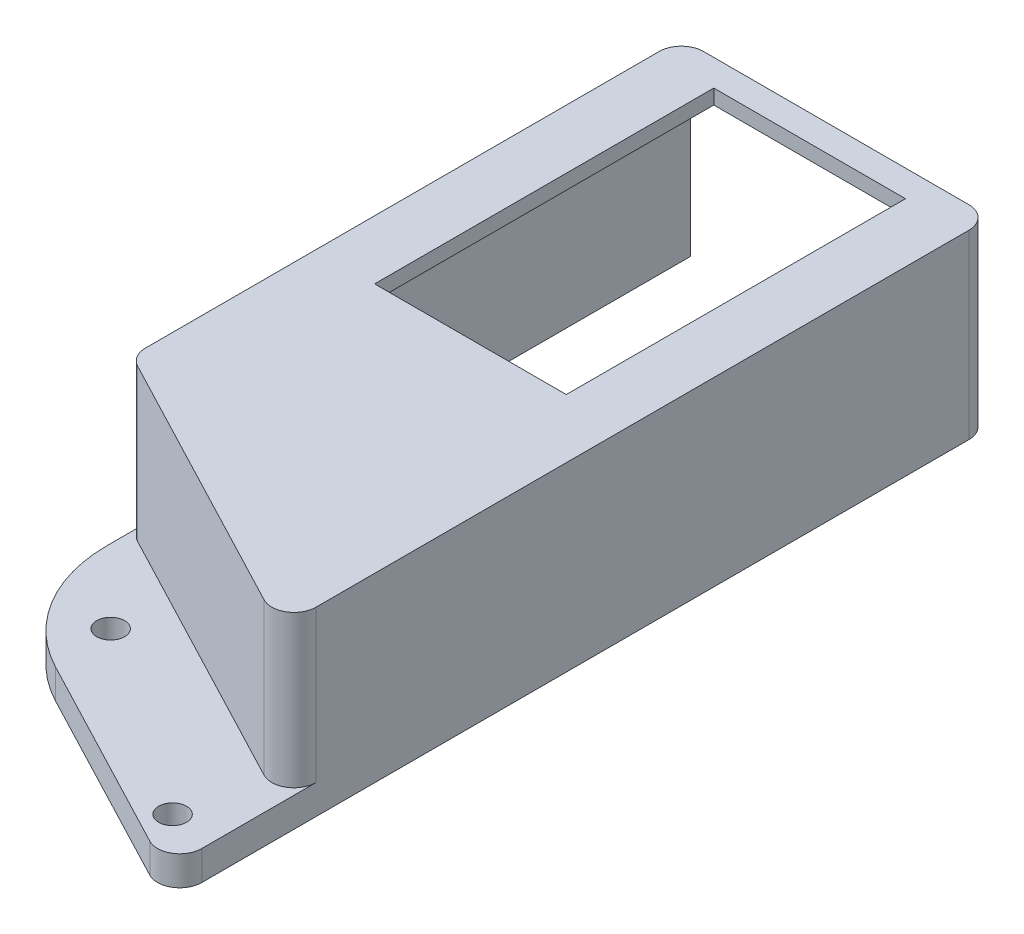
ISO-10303-21;
HEADER;
FILE_DESCRIPTION(('STEP AP214'),'2;1');
FILE_NAME('part.step','',(''),(''),'','','');
FILE_SCHEMA(('AUTOMOTIVE_DESIGN { 1 0 10303 214 1 1 1 1 }'));
ENDSEC;
DATA;
#1=APPLICATION_CONTEXT('core data for automotive mechanical design processes');
#2=APPLICATION_PROTOCOL_DEFINITION('international standard','automotive_design',2000,#1);
#3=PRODUCT_CONTEXT('',#1,'mechanical');
#4=PRODUCT('Part','Part','',(#3));
#5=PRODUCT_RELATED_PRODUCT_CATEGORY('part','',(#4));
#6=PRODUCT_DEFINITION_FORMATION('','',#4);
#7=PRODUCT_DEFINITION_CONTEXT('part definition',#1,'design');
#8=PRODUCT_DEFINITION('design','',#6,#7);
#9=PRODUCT_DEFINITION_SHAPE('','',#8);
#10=(LENGTH_UNIT() NAMED_UNIT(*) SI_UNIT(.MILLI.,.METRE.));
#11=(NAMED_UNIT(*) PLANE_ANGLE_UNIT() SI_UNIT($,.RADIAN.));
#12=(NAMED_UNIT(*) SI_UNIT($,.STERADIAN.) SOLID_ANGLE_UNIT());
#13=UNCERTAINTY_MEASURE_WITH_UNIT(LENGTH_MEASURE(1.E-05),#10,'distance_accuracy_value','');
#14=(GEOMETRIC_REPRESENTATION_CONTEXT(3) GLOBAL_UNCERTAINTY_ASSIGNED_CONTEXT((#13)) GLOBAL_UNIT_ASSIGNED_CONTEXT((#10,
#11,#12)) REPRESENTATION_CONTEXT('',''));
#15=CARTESIAN_POINT('',(0.,0.,0.));
#16=DIRECTION('',(0.,0.,1.));
#17=DIRECTION('',(1.,0.,0.));
#18=AXIS2_PLACEMENT_3D('',#15,#16,#17);
#19=CARTESIAN_POINT('',(-10.5,-12.3,0.));
#20=DIRECTION('',(1.,0.,0.));
#21=DIRECTION('',(0.,0.,-1.));
#22=AXIS2_PLACEMENT_3D('',#19,#20,#21);
#23=PLANE('',#22);
#24=DIRECTION('',(0.,0.,-1.));
#25=VECTOR('',#24,1.);
#26=CARTESIAN_POINT('',(-10.5,0.,0.));
#27=LINE('',#26,#25);
#28=CARTESIAN_POINT('',(-10.5,0.,36.3430124226153));
#29=VERTEX_POINT('',#28);
#30=CARTESIAN_POINT('',(-10.5,0.,1.5));
#31=VERTEX_POINT('',#30);
#32=EDGE_CURVE('E219',#29,#31,#27,.T.);
#33=ORIENTED_EDGE('',*,*,#32,.T.);
#34=DIRECTION('',(0.,1.,0.));
#35=VECTOR('',#34,1.);
#36=CARTESIAN_POINT('',(-10.5,-12.3,1.5));
#37=LINE('',#36,#35);
#38=CARTESIAN_POINT('',(-10.5,-12.3,1.5));
#39=VERTEX_POINT('',#38);
#40=EDGE_CURVE('E321',#31,#39,#37,.F.);
#41=ORIENTED_EDGE('',*,*,#40,.T.);
#42=DIRECTION('',(0.,0.,-1.));
#43=VECTOR('',#42,1.);
#44=CARTESIAN_POINT('',(-10.5,-12.3,0.));
#45=LINE('',#44,#43);
#46=CARTESIAN_POINT('',(-10.5,-12.3,38.9492670560669));
#47=VERTEX_POINT('',#46);
#48=EDGE_CURVE('E218',#47,#39,#45,.T.);
#49=ORIENTED_EDGE('',*,*,#48,.F.);
#50=DIRECTION('',(0.,1.,0.));
#51=VECTOR('',#50,1.);
#52=CARTESIAN_POINT('',(-10.5,-12.3,38.9492670560669));
#53=LINE('',#52,#51);
#54=CARTESIAN_POINT('',(-10.5,-10.3,38.9492670560669));
#55=VERTEX_POINT('',#54);
#56=EDGE_CURVE('E237',#47,#55,#53,.T.);
#57=ORIENTED_EDGE('',*,*,#56,.T.);
#58=DIRECTION('',(0.,0.,-1.));
#59=VECTOR('',#58,1.);
#60=CARTESIAN_POINT('',(-10.5,-10.3,0.));
#61=LINE('',#60,#59);
#62=CARTESIAN_POINT('',(-10.5,-10.3,36.3430124226153));
#63=VERTEX_POINT('',#62);
#64=EDGE_CURVE('E81',#55,#63,#61,.T.);
#65=ORIENTED_EDGE('',*,*,#64,.T.);
#66=DIRECTION('',(0.,1.,0.));
#67=VECTOR('',#66,1.);
#68=CARTESIAN_POINT('',(-10.5,0.,36.3430124226153));
#69=LINE('',#68,#67);
#70=EDGE_CURVE('E318',#63,#29,#69,.T.);
#71=ORIENTED_EDGE('',*,*,#70,.T.);
#72=EDGE_LOOP('',(#33,#41,#49,#57,#65,#71));
#73=FACE_BOUND('',#72,.T.);
#74=ADVANCED_FACE('F65',(#73),#23,.F.);
#75=CARTESIAN_POINT('',(0.,0.,0.));
#76=DIRECTION('',(0.,1.,0.));
#77=DIRECTION('',(0.,0.,1.));
#78=AXIS2_PLACEMENT_3D('',#75,#76,#77);
#79=PLANE('',#78);
#80=DIRECTION('',(1.,0.,0.));
#81=VECTOR('',#80,1.);
#82=CARTESIAN_POINT('',(0.,0.,1.80066534325666));
#83=LINE('',#82,#81);
#84=CARTESIAN_POINT('',(-6.5,0.,1.80066534325666));
#85=VERTEX_POINT('',#84);
#86=CARTESIAN_POINT('',(6.5,0.,1.80066534325666));
#87=VERTEX_POINT('',#86);
#88=EDGE_CURVE('E382',#85,#87,#83,.T.);
#89=ORIENTED_EDGE('',*,*,#88,.T.);
#90=DIRECTION('',(0.,0.,1.));
#91=VECTOR('',#90,1.);
#92=CARTESIAN_POINT('',(6.5,0.,0.));
#93=LINE('',#92,#91);
#94=CARTESIAN_POINT('',(6.5,0.,24.8006653432567));
#95=VERTEX_POINT('',#94);
#96=EDGE_CURVE('E378',#87,#95,#93,.T.);
#97=ORIENTED_EDGE('',*,*,#96,.T.);
#98=DIRECTION('',(1.,0.,0.));
#99=VECTOR('',#98,1.);
#100=CARTESIAN_POINT('',(0.,0.,24.8006653432567));
#101=LINE('',#100,#99);
#102=CARTESIAN_POINT('',(-6.5,0.,24.8006653432567));
#103=VERTEX_POINT('',#102);
#104=EDGE_CURVE('E374',#103,#95,#101,.T.);
#105=ORIENTED_EDGE('',*,*,#104,.F.);
#106=DIRECTION('',(0.,0.,1.));
#107=VECTOR('',#106,1.);
#108=CARTESIAN_POINT('',(-6.5,0.,0.));
#109=LINE('',#108,#107);
#110=EDGE_CURVE('E337',#85,#103,#109,.T.);
#111=ORIENTED_EDGE('',*,*,#110,.F.);
#112=EDGE_LOOP('',(#89,#97,#105,#111));
#113=FACE_BOUND('',#112,.T.);
#114=DIRECTION('',(0.,0.,1.));
#115=VECTOR('',#114,1.);
#116=CARTESIAN_POINT('',(10.5,0.,0.));
#117=LINE('',#116,#115);
#118=CARTESIAN_POINT('',(10.5,0.,1.5));
#119=VERTEX_POINT('',#118);
#120=CARTESIAN_POINT('',(10.5,0.,45.7715838511867));
#121=VERTEX_POINT('',#120);
#122=EDGE_CURVE('E386',#119,#121,#117,.T.);
#123=ORIENTED_EDGE('',*,*,#122,.F.);
#124=CARTESIAN_POINT('',(9.,0.,1.5));
#125=DIRECTION('',(0.,1.,0.));
#126=DIRECTION('',(0.,0.,1.));
#127=AXIS2_PLACEMENT_3D('',#124,#125,#126);
#128=CIRCLE('',#127,1.5);
#129=CARTESIAN_POINT('',(9.,0.,0.));
#130=VERTEX_POINT('',#129);
#131=EDGE_CURVE('E277',#119,#130,#128,.T.);
#132=ORIENTED_EDGE('',*,*,#131,.T.);
#133=DIRECTION('',(1.,0.,0.));
#134=VECTOR('',#133,1.);
#135=CARTESIAN_POINT('',(0.,0.,0.));
#136=LINE('',#135,#134);
#137=CARTESIAN_POINT('',(-9.,0.,0.));
#138=VERTEX_POINT('',#137);
#139=EDGE_CURVE('E346',#138,#130,#136,.T.);
#140=ORIENTED_EDGE('',*,*,#139,.F.);
#141=CARTESIAN_POINT('',(-9.,0.,1.5));
#142=DIRECTION('',(0.,1.,0.));
#143=DIRECTION('',(0.,0.,1.));
#144=AXIS2_PLACEMENT_3D('',#141,#142,#143);
#145=CIRCLE('',#144,1.5);
#146=EDGE_CURVE('E271',#138,#31,#145,.T.);
#147=ORIENTED_EDGE('',*,*,#146,.T.);
#148=ORIENTED_EDGE('',*,*,#32,.F.);
#149=CARTESIAN_POINT('',(-9.,0.,36.3430124226153));
#150=DIRECTION('',(0.,1.,0.));
#151=DIRECTION('',(0.,0.,1.));
#152=AXIS2_PLACEMENT_3D('',#149,#150,#151);
#153=CIRCLE('',#152,1.5);
#154=CARTESIAN_POINT('',(-9.69601049200583,0.,37.6717597255356));
#155=VERTEX_POINT('',#154);
#156=EDGE_CURVE('E268',#29,#155,#153,.T.);
#157=ORIENTED_EDGE('',*,*,#156,.T.);
#158=DIRECTION('',(0.885831535280156,0.,0.464006994670557));
#159=VECTOR('',#158,1.);
#160=CARTESIAN_POINT('',(-17.5718750287036,0.,33.5463068729796));
#161=LINE('',#160,#159);
#162=CARTESIAN_POINT('',(8.30398950799418,0.,47.100331154107));
#163=VERTEX_POINT('',#162);
#164=EDGE_CURVE('E429',#155,#163,#161,.T.);
#165=ORIENTED_EDGE('',*,*,#164,.T.);
#166=CARTESIAN_POINT('',(9.00000000000001,0.,45.7715838511867));
#167=DIRECTION('',(0.,1.,0.));
#168=DIRECTION('',(0.,0.,1.));
#169=AXIS2_PLACEMENT_3D('',#166,#167,#168);
#170=CIRCLE('',#169,1.5);
#171=EDGE_CURVE('E274',#163,#121,#170,.T.);
#172=ORIENTED_EDGE('',*,*,#171,.T.);
#173=EDGE_LOOP('',(#123,#132,#140,#147,#148,#157,#165,#172));
#174=FACE_BOUND('',#173,.T.);
#175=ADVANCED_FACE('F351',(#113,#174),#79,.T.);
#176=CARTESIAN_POINT('',(10.5,-1.,0.));
#177=DIRECTION('',(-1.,0.,0.));
#178=DIRECTION('',(0.,0.,1.));
#179=AXIS2_PLACEMENT_3D('',#176,#177,#178);
#180=PLANE('',#179);
#181=DIRECTION('',(0.,0.,1.));
#182=VECTOR('',#181,1.);
#183=CARTESIAN_POINT('',(10.5,-12.3,0.));
#184=LINE('',#183,#182);
#185=CARTESIAN_POINT('',(10.5,-12.3,1.5));
#186=VERTEX_POINT('',#185);
#187=CARTESIAN_POINT('',(10.5,-12.3,53.5209614869815));
#188=VERTEX_POINT('',#187);
#189=EDGE_CURVE('E413',#186,#188,#184,.T.);
#190=ORIENTED_EDGE('',*,*,#189,.F.);
#191=DIRECTION('',(0.,1.,0.));
#192=VECTOR('',#191,1.);
#193=CARTESIAN_POINT('',(10.5,-1.,1.5));
#194=LINE('',#193,#192);
#195=EDGE_CURVE('E264',#186,#119,#194,.T.);
#196=ORIENTED_EDGE('',*,*,#195,.T.);
#197=ORIENTED_EDGE('',*,*,#122,.T.);
#198=DIRECTION('',(0.,1.,0.));
#199=VECTOR('',#198,1.);
#200=CARTESIAN_POINT('',(10.5,-10.3,45.7715838511867));
#201=LINE('',#200,#199);
#202=CARTESIAN_POINT('',(10.5,-10.3,45.7715838511867));
#203=VERTEX_POINT('',#202);
#204=EDGE_CURVE('E257',#121,#203,#201,.F.);
#205=ORIENTED_EDGE('',*,*,#204,.T.);
#206=DIRECTION('',(0.,0.,1.));
#207=VECTOR('',#206,1.);
#208=CARTESIAN_POINT('',(10.5,-10.3,0.));
#209=LINE('',#208,#207);
#210=CARTESIAN_POINT('',(10.5,-10.3,53.5209614869815));
#211=VERTEX_POINT('',#210);
#212=EDGE_CURVE('E231',#203,#211,#209,.T.);
#213=ORIENTED_EDGE('',*,*,#212,.T.);
#214=DIRECTION('',(0.,1.,0.));
#215=VECTOR('',#214,1.);
#216=CARTESIAN_POINT('',(10.5,-1.,53.5209614869815));
#217=LINE('',#216,#215);
#218=EDGE_CURVE('E261',#211,#188,#217,.F.);
#219=ORIENTED_EDGE('',*,*,#218,.T.);
#220=EDGE_LOOP('',(#190,#196,#197,#205,#213,#219));
#221=FACE_BOUND('',#220,.T.);
#222=ADVANCED_FACE('F475',(#221),#180,.F.);
#223=CARTESIAN_POINT('',(-20.7571174377224,-12.3,39.6272241992883));
#224=DIRECTION('',(0.464006994670557,0.,-0.885831535280155));
#225=DIRECTION('',(-0.885831535280155,0.,-0.464006994670557));
#226=AXIS2_PLACEMENT_3D('',#223,#224,#225);
#227=PLANE('',#226);
#228=DIRECTION('',(-0.885831535280155,0.,-0.464006994670557));
#229=VECTOR('',#228,1.);
#230=CARTESIAN_POINT('',(-20.7571174377224,-12.3,39.6272241992883));
#231=LINE('',#230,#229);
#232=CARTESIAN_POINT('',(8.30398950799417,-12.3,54.8497087899017));
#233=VERTEX_POINT('',#232);
#234=CARTESIAN_POINT('',(-5.14006994670557,-12.3,47.8075824088685));
#235=VERTEX_POINT('',#234);
#236=EDGE_CURVE('E418',#233,#235,#231,.T.);
#237=ORIENTED_EDGE('',*,*,#236,.F.);
#238=DIRECTION('',(0.,1.,0.));
#239=VECTOR('',#238,1.);
#240=CARTESIAN_POINT('',(8.30398950799417,-12.3,54.8497087899017));
#241=LINE('',#240,#239);
#242=CARTESIAN_POINT('',(8.30398950799417,-10.3,54.8497087899017));
#243=VERTEX_POINT('',#242);
#244=EDGE_CURVE('E304',#233,#243,#241,.T.);
#245=ORIENTED_EDGE('',*,*,#244,.T.);
#246=DIRECTION('',(-0.885831535280155,0.,-0.464006994670557));
#247=VECTOR('',#246,1.);
#248=CARTESIAN_POINT('',(-20.7571174377224,-10.3,39.6272241992883));
#249=LINE('',#248,#247);
#250=CARTESIAN_POINT('',(-5.14006994670557,-10.3,47.8075824088685));
#251=VERTEX_POINT('',#250);
#252=EDGE_CURVE('E437',#243,#251,#249,.T.);
#253=ORIENTED_EDGE('',*,*,#252,.T.);
#254=DIRECTION('',(0.,1.,0.));
#255=VECTOR('',#254,1.);
#256=CARTESIAN_POINT('',(-5.14006994670557,-12.3,47.8075824088685));
#257=LINE('',#256,#255);
#258=EDGE_CURVE('E250',#251,#235,#257,.F.);
#259=ORIENTED_EDGE('',*,*,#258,.T.);
#260=EDGE_LOOP('',(#237,#245,#253,#259));
#261=FACE_BOUND('',#260,.T.);
#262=ADVANCED_FACE('F466',(#261),#227,.F.);
#263=CARTESIAN_POINT('',(7.50000000000001,-12.3,52.5));
#264=DIRECTION('',(0.,1.,0.));
#265=DIRECTION('',(0.,0.,1.));
#266=AXIS2_PLACEMENT_3D('',#263,#264,#265);
#267=CYLINDRICAL_SURFACE('',#266,0.94630539720182);
#268=CARTESIAN_POINT('',(7.50000000000001,-12.3,52.5));
#269=DIRECTION('',(0.,1.,0.));
#270=DIRECTION('',(0.,0.,1.));
#271=AXIS2_PLACEMENT_3D('',#268,#269,#270);
#272=CIRCLE('',#271,0.94630539720182);
#273=CARTESIAN_POINT('',(7.50000000000001,-12.3,53.4463053972018));
#274=VERTEX_POINT('',#273);
#275=EDGE_CURVE('E422',#274,#274,#272,.T.);
#276=ORIENTED_EDGE('',*,*,#275,.F.);
#277=EDGE_LOOP('',(#276));
#278=FACE_BOUND('',#277,.T.);
#279=CARTESIAN_POINT('',(7.50000000000001,-10.3,52.5));
#280=DIRECTION('',(0.,1.,0.));
#281=DIRECTION('',(0.,0.,1.));
#282=AXIS2_PLACEMENT_3D('',#279,#280,#281);
#283=CIRCLE('',#282,0.94630539720182);
#284=CARTESIAN_POINT('',(7.50000000000001,-10.3,53.4463053972018));
#285=VERTEX_POINT('',#284);
#286=EDGE_CURVE('E445',#285,#285,#283,.T.);
#287=ORIENTED_EDGE('',*,*,#286,.T.);
#288=EDGE_LOOP('',(#287));
#289=FACE_BOUND('',#288,.T.);
#290=ADVANCED_FACE('F516',(#278,#289),#267,.F.);
#291=CARTESIAN_POINT('',(-5.49999999999999,-12.3,43.7));
#292=DIRECTION('',(0.,1.,0.));
#293=DIRECTION('',(0.,0.,1.));
#294=AXIS2_PLACEMENT_3D('',#291,#292,#293);
#295=CYLINDRICAL_SURFACE('',#294,0.946305397201834);
#296=CARTESIAN_POINT('',(-5.49999999999999,-12.3,43.7));
#297=DIRECTION('',(0.,1.,0.));
#298=DIRECTION('',(0.,0.,1.));
#299=AXIS2_PLACEMENT_3D('',#296,#297,#298);
#300=CIRCLE('',#299,0.946305397201834);
#301=CARTESIAN_POINT('',(-5.49999999999999,-12.3,44.6463053972018));
#302=VERTEX_POINT('',#301);
#303=EDGE_CURVE('E230',#302,#302,#300,.T.);
#304=ORIENTED_EDGE('',*,*,#303,.F.);
#305=EDGE_LOOP('',(#304));
#306=FACE_BOUND('',#305,.T.);
#307=CARTESIAN_POINT('',(-5.49999999999999,-10.3,43.7));
#308=DIRECTION('',(0.,1.,0.));
#309=DIRECTION('',(0.,0.,1.));
#310=AXIS2_PLACEMENT_3D('',#307,#308,#309);
#311=CIRCLE('',#310,0.946305397201834);
#312=CARTESIAN_POINT('',(-5.49999999999999,-10.3,44.6463053972018));
#313=VERTEX_POINT('',#312);
#314=EDGE_CURVE('E433',#313,#313,#311,.T.);
#315=ORIENTED_EDGE('',*,*,#314,.T.);
#316=EDGE_LOOP('',(#315));
#317=FACE_BOUND('',#316,.T.);
#318=ADVANCED_FACE('F453',(#306,#317),#295,.F.);
#319=CARTESIAN_POINT('',(-9.7,-12.3,0.));
#320=DIRECTION('',(-1.,0.,0.));
#321=DIRECTION('',(0.,0.,1.));
#322=AXIS2_PLACEMENT_3D('',#319,#320,#321);
#323=PLANE('',#322);
#324=DIRECTION('',(0.,0.,1.));
#325=VECTOR('',#324,1.);
#326=CARTESIAN_POINT('',(-9.7,-12.3,0.));
#327=LINE('',#326,#325);
#328=CARTESIAN_POINT('',(-9.7,-12.3,0.173350083857839));
#329=VERTEX_POINT('',#328);
#330=CARTESIAN_POINT('',(-9.7,-12.3,35.993109849659));
#331=VERTEX_POINT('',#330);
#332=EDGE_CURVE('E204',#329,#331,#327,.T.);
#333=ORIENTED_EDGE('',*,*,#332,.F.);
#334=DIRECTION('',(0.,1.,0.));
#335=VECTOR('',#334,1.);
#336=CARTESIAN_POINT('',(-9.7,-12.3,0.173350083857839));
#337=LINE('',#336,#335);
#338=CARTESIAN_POINT('',(-9.7,-0.999999999999999,0.173350083857839));
#339=VERTEX_POINT('',#338);
#340=EDGE_CURVE('E324',#329,#339,#337,.T.);
#341=ORIENTED_EDGE('',*,*,#340,.T.);
#342=DIRECTION('',(0.,0.,1.));
#343=VECTOR('',#342,1.);
#344=CARTESIAN_POINT('',(-9.7,-1.,0.));
#345=LINE('',#344,#343);
#346=CARTESIAN_POINT('',(-9.69999999999999,-1.,35.993109849659));
#347=VERTEX_POINT('',#346);
#348=EDGE_CURVE('E235',#339,#347,#345,.T.);
#349=ORIENTED_EDGE('',*,*,#348,.T.);
#350=DIRECTION('',(0.,1.,0.));
#351=VECTOR('',#350,1.);
#352=CARTESIAN_POINT('',(-9.7,-12.3,35.993109849659));
#353=LINE('',#352,#351);
#354=EDGE_CURVE('E225',#331,#347,#353,.T.);
#355=ORIENTED_EDGE('',*,*,#354,.F.);
#356=EDGE_LOOP('',(#333,#341,#349,#355));
#357=FACE_BOUND('',#356,.T.);
#358=ADVANCED_FACE('F233',(#357),#323,.F.);
#359=CARTESIAN_POINT('',(0.,-12.3,0.));
#360=DIRECTION('',(0.,0.,1.));
#361=DIRECTION('',(1.,0.,0.));
#362=AXIS2_PLACEMENT_3D('',#359,#360,#361);
#363=PLANE('',#362);
#364=ORIENTED_EDGE('',*,*,#139,.T.);
#365=DIRECTION('',(0.,1.,0.));
#366=VECTOR('',#365,1.);
#367=CARTESIAN_POINT('',(9.,-12.3,0.));
#368=LINE('',#367,#366);
#369=CARTESIAN_POINT('',(9.,-1.,0.));
#370=VERTEX_POINT('',#369);
#371=EDGE_CURVE('E284',#130,#370,#368,.F.);
#372=ORIENTED_EDGE('',*,*,#371,.T.);
#373=DIRECTION('',(1.,0.,0.));
#374=VECTOR('',#373,1.);
#375=CARTESIAN_POINT('',(0.,-1.,0.));
#376=LINE('',#375,#374);
#377=CARTESIAN_POINT('',(-9.,-1.,0.));
#378=VERTEX_POINT('',#377);
#379=EDGE_CURVE('E348',#378,#370,#376,.T.);
#380=ORIENTED_EDGE('',*,*,#379,.F.);
#381=DIRECTION('',(0.,1.,0.));
#382=VECTOR('',#381,1.);
#383=CARTESIAN_POINT('',(-9.,-12.3,0.));
#384=LINE('',#383,#382);
#385=EDGE_CURVE('E280',#378,#138,#384,.T.);
#386=ORIENTED_EDGE('',*,*,#385,.T.);
#387=EDGE_LOOP('',(#364,#372,#380,#386));
#388=FACE_BOUND('',#387,.T.);
#389=ADVANCED_FACE('F345',(#388),#363,.F.);
#390=CARTESIAN_POINT('',(0.,-12.3,0.));
#391=DIRECTION('',(0.,1.,0.));
#392=DIRECTION('',(0.,0.,1.));
#393=AXIS2_PLACEMENT_3D('',#390,#391,#392);
#394=PLANE('',#393);
#395=DIRECTION('',(0.,0.,1.));
#396=VECTOR('',#395,1.);
#397=CARTESIAN_POINT('',(9.7,-12.3,0.));
#398=LINE('',#397,#396);
#399=CARTESIAN_POINT('',(9.7,-12.3,0.173350083857838));
#400=VERTEX_POINT('',#399);
#401=CARTESIAN_POINT('',(9.7,-12.3,46.1550146115638));
#402=VERTEX_POINT('',#401);
#403=EDGE_CURVE('E410',#400,#402,#398,.T.);
#404=ORIENTED_EDGE('',*,*,#403,.F.);
#405=CARTESIAN_POINT('',(9.,-12.3,1.5));
#406=DIRECTION('',(0.,1.,0.));
#407=DIRECTION('',(0.,0.,1.));
#408=AXIS2_PLACEMENT_3D('',#405,#406,#407);
#409=CIRCLE('',#408,1.5);
#410=EDGE_CURVE('E301',#400,#186,#409,.F.);
#411=ORIENTED_EDGE('',*,*,#410,.T.);
#412=ORIENTED_EDGE('',*,*,#189,.T.);
#413=CARTESIAN_POINT('',(9.00000000000001,-12.3,53.5209614869815));
#414=DIRECTION('',(0.,1.,0.));
#415=DIRECTION('',(0.,0.,1.));
#416=AXIS2_PLACEMENT_3D('',#413,#414,#415);
#417=CIRCLE('',#416,1.5);
#418=EDGE_CURVE('E298',#188,#233,#417,.F.);
#419=ORIENTED_EDGE('',*,*,#418,.T.);
#420=ORIENTED_EDGE('',*,*,#236,.T.);
#421=CARTESIAN_POINT('',(-0.499999999999997,-12.3,38.9492670560669));
#422=DIRECTION('',(0.,1.,0.));
#423=DIRECTION('',(0.,0.,1.));
#424=AXIS2_PLACEMENT_3D('',#421,#422,#423);
#425=CIRCLE('',#424,10.);
#426=EDGE_CURVE('E254',#235,#47,#425,.F.);
#427=ORIENTED_EDGE('',*,*,#426,.T.);
#428=ORIENTED_EDGE('',*,*,#48,.T.);
#429=CARTESIAN_POINT('',(-9.,-12.3,1.5));
#430=DIRECTION('',(0.,1.,0.));
#431=DIRECTION('',(0.,0.,1.));
#432=AXIS2_PLACEMENT_3D('',#429,#430,#431);
#433=CIRCLE('',#432,1.5);
#434=EDGE_CURVE('E213',#39,#329,#433,.F.);
#435=ORIENTED_EDGE('',*,*,#434,.T.);
#436=ORIENTED_EDGE('',*,*,#332,.T.);
#437=DIRECTION('',(-0.885831535280156,0.,-0.464006994670557));
#438=VECTOR('',#437,1.);
#439=CARTESIAN_POINT('',(10.5,-12.3,46.5740622306114));
#440=LINE('',#439,#438);
#441=EDGE_CURVE('E209',#402,#331,#440,.T.);
#442=ORIENTED_EDGE('',*,*,#441,.F.);
#443=EDGE_LOOP('',(#404,#411,#412,#419,#420,#427,#428,#435,#436,#442));
#444=FACE_BOUND('',#443,.T.);
#445=ORIENTED_EDGE('',*,*,#303,.T.);
#446=EDGE_LOOP('',(#445));
#447=FACE_BOUND('',#446,.T.);
#448=ORIENTED_EDGE('',*,*,#275,.T.);
#449=EDGE_LOOP('',(#448));
#450=FACE_BOUND('',#449,.T.);
#451=ADVANCED_FACE('F207',(#444,#447,#450),#394,.F.);
#452=CARTESIAN_POINT('',(0.,-1.,1.80066534325666));
#453=DIRECTION('',(0.,0.,1.));
#454=DIRECTION('',(1.,0.,0.));
#455=AXIS2_PLACEMENT_3D('',#452,#453,#454);
#456=PLANE('',#455);
#457=ORIENTED_EDGE('',*,*,#88,.F.);
#458=DIRECTION('',(0.,1.,0.));
#459=VECTOR('',#458,1.);
#460=CARTESIAN_POINT('',(-6.5,-1.,1.80066534325666));
#461=LINE('',#460,#459);
#462=CARTESIAN_POINT('',(-6.5,-1.,1.80066534325666));
#463=VERTEX_POINT('',#462);
#464=EDGE_CURVE('E355',#463,#85,#461,.T.);
#465=ORIENTED_EDGE('',*,*,#464,.F.);
#466=DIRECTION('',(1.,0.,0.));
#467=VECTOR('',#466,1.);
#468=CARTESIAN_POINT('',(0.,-1.,1.80066534325666));
#469=LINE('',#468,#467);
#470=CARTESIAN_POINT('',(6.5,-1.,1.80066534325666));
#471=VERTEX_POINT('',#470);
#472=EDGE_CURVE('E400',#463,#471,#469,.T.);
#473=ORIENTED_EDGE('',*,*,#472,.T.);
#474=DIRECTION('',(0.,1.,0.));
#475=VECTOR('',#474,1.);
#476=CARTESIAN_POINT('',(6.5,-1.,1.80066534325666));
#477=LINE('',#476,#475);
#478=EDGE_CURVE('E361',#471,#87,#477,.T.);
#479=ORIENTED_EDGE('',*,*,#478,.T.);
#480=EDGE_LOOP('',(#457,#465,#473,#479));
#481=FACE_BOUND('',#480,.T.);
#482=ADVANCED_FACE('F540',(#481),#456,.T.);
#483=CARTESIAN_POINT('',(-6.5,-1.,0.));
#484=DIRECTION('',(-1.,0.,0.));
#485=DIRECTION('',(0.,0.,1.));
#486=AXIS2_PLACEMENT_3D('',#483,#484,#485);
#487=PLANE('',#486);
#488=ORIENTED_EDGE('',*,*,#110,.T.);
#489=DIRECTION('',(0.,1.,0.));
#490=VECTOR('',#489,1.);
#491=CARTESIAN_POINT('',(-6.5,-1.,24.8006653432567));
#492=LINE('',#491,#490);
#493=CARTESIAN_POINT('',(-6.5,-1.,24.8006653432567));
#494=VERTEX_POINT('',#493);
#495=EDGE_CURVE('E358',#494,#103,#492,.T.);
#496=ORIENTED_EDGE('',*,*,#495,.F.);
#497=DIRECTION('',(0.,0.,1.));
#498=VECTOR('',#497,1.);
#499=CARTESIAN_POINT('',(-6.5,-1.,0.));
#500=LINE('',#499,#498);
#501=EDGE_CURVE('E365',#463,#494,#500,.T.);
#502=ORIENTED_EDGE('',*,*,#501,.F.);
#503=ORIENTED_EDGE('',*,*,#464,.T.);
#504=EDGE_LOOP('',(#488,#496,#502,#503));
#505=FACE_BOUND('',#504,.T.);
#506=ADVANCED_FACE('F536',(#505),#487,.F.);
#507=CARTESIAN_POINT('',(0.,-1.,24.8006653432567));
#508=DIRECTION('',(0.,0.,1.));
#509=DIRECTION('',(1.,0.,0.));
#510=AXIS2_PLACEMENT_3D('',#507,#508,#509);
#511=PLANE('',#510);
#512=ORIENTED_EDGE('',*,*,#104,.T.);
#513=DIRECTION('',(0.,1.,0.));
#514=VECTOR('',#513,1.);
#515=CARTESIAN_POINT('',(6.5,-1.,24.8006653432567));
#516=LINE('',#515,#514);
#517=CARTESIAN_POINT('',(6.5,-1.,24.8006653432567));
#518=VERTEX_POINT('',#517);
#519=EDGE_CURVE('E364',#518,#95,#516,.T.);
#520=ORIENTED_EDGE('',*,*,#519,.F.);
#521=DIRECTION('',(1.,0.,0.));
#522=VECTOR('',#521,1.);
#523=CARTESIAN_POINT('',(0.,-1.,24.8006653432567));
#524=LINE('',#523,#522);
#525=EDGE_CURVE('E393',#494,#518,#524,.T.);
#526=ORIENTED_EDGE('',*,*,#525,.F.);
#527=ORIENTED_EDGE('',*,*,#495,.T.);
#528=EDGE_LOOP('',(#512,#520,#526,#527));
#529=FACE_BOUND('',#528,.T.);
#530=ADVANCED_FACE('F539',(#529),#511,.F.);
#531=CARTESIAN_POINT('',(6.5,-1.,0.));
#532=DIRECTION('',(-1.,0.,0.));
#533=DIRECTION('',(0.,0.,1.));
#534=AXIS2_PLACEMENT_3D('',#531,#532,#533);
#535=PLANE('',#534);
#536=ORIENTED_EDGE('',*,*,#96,.F.);
#537=ORIENTED_EDGE('',*,*,#478,.F.);
#538=DIRECTION('',(0.,0.,1.));
#539=VECTOR('',#538,1.);
#540=CARTESIAN_POINT('',(6.5,-1.,0.));
#541=LINE('',#540,#539);
#542=EDGE_CURVE('E396',#471,#518,#541,.T.);
#543=ORIENTED_EDGE('',*,*,#542,.T.);
#544=ORIENTED_EDGE('',*,*,#519,.T.);
#545=EDGE_LOOP('',(#536,#537,#543,#544));
#546=FACE_BOUND('',#545,.T.);
#547=ADVANCED_FACE('F535',(#546),#535,.T.);
#548=CARTESIAN_POINT('',(0.,-1.,0.));
#549=DIRECTION('',(0.,1.,0.));
#550=DIRECTION('',(0.,0.,1.));
#551=AXIS2_PLACEMENT_3D('',#548,#549,#550);
#552=PLANE('',#551);
#553=ORIENTED_EDGE('',*,*,#379,.T.);
#554=CARTESIAN_POINT('',(9.,-1.,1.5));
#555=DIRECTION('',(0.,1.,0.));
#556=DIRECTION('',(0.,0.,1.));
#557=AXIS2_PLACEMENT_3D('',#554,#555,#556);
#558=CIRCLE('',#557,1.5);
#559=CARTESIAN_POINT('',(9.7,-1.,0.173350083857838));
#560=VERTEX_POINT('',#559);
#561=EDGE_CURVE('E290',#370,#560,#558,.F.);
#562=ORIENTED_EDGE('',*,*,#561,.T.);
#563=DIRECTION('',(0.,0.,1.));
#564=VECTOR('',#563,1.);
#565=CARTESIAN_POINT('',(9.7,-1.,0.));
#566=LINE('',#565,#564);
#567=CARTESIAN_POINT('',(9.7,-0.999999999999999,46.1550146115638));
#568=VERTEX_POINT('',#567);
#569=EDGE_CURVE('E336',#560,#568,#566,.T.);
#570=ORIENTED_EDGE('',*,*,#569,.T.);
#571=DIRECTION('',(-0.885831535280156,0.,-0.464006994670557));
#572=VECTOR('',#571,1.);
#573=CARTESIAN_POINT('',(-16.882755116141,-1.,32.2307143126328));
#574=LINE('',#573,#572);
#575=EDGE_CURVE('E334',#568,#347,#574,.T.);
#576=ORIENTED_EDGE('',*,*,#575,.T.);
#577=ORIENTED_EDGE('',*,*,#348,.F.);
#578=CARTESIAN_POINT('',(-9.,-0.999999999999999,1.5));
#579=DIRECTION('',(0.,1.,0.));
#580=DIRECTION('',(0.,0.,1.));
#581=AXIS2_PLACEMENT_3D('',#578,#579,#580);
#582=CIRCLE('',#581,1.5);
#583=EDGE_CURVE('E287',#339,#378,#582,.F.);
#584=ORIENTED_EDGE('',*,*,#583,.T.);
#585=EDGE_LOOP('',(#553,#562,#570,#576,#577,#584));
#586=FACE_BOUND('',#585,.T.);
#587=ORIENTED_EDGE('',*,*,#472,.F.);
#588=ORIENTED_EDGE('',*,*,#501,.T.);
#589=ORIENTED_EDGE('',*,*,#525,.T.);
#590=ORIENTED_EDGE('',*,*,#542,.F.);
#591=EDGE_LOOP('',(#587,#588,#589,#590));
#592=FACE_BOUND('',#591,.T.);
#593=ADVANCED_FACE('F331',(#586,#592),#552,.F.);
#594=CARTESIAN_POINT('',(9.7,-12.3,0.));
#595=DIRECTION('',(-1.,0.,0.));
#596=DIRECTION('',(0.,0.,1.));
#597=AXIS2_PLACEMENT_3D('',#594,#595,#596);
#598=PLANE('',#597);
#599=ORIENTED_EDGE('',*,*,#569,.F.);
#600=DIRECTION('',(0.,1.,0.));
#601=VECTOR('',#600,1.);
#602=CARTESIAN_POINT('',(9.7,-1.,0.173350083857838));
#603=LINE('',#602,#601);
#604=EDGE_CURVE('E293',#560,#400,#603,.F.);
#605=ORIENTED_EDGE('',*,*,#604,.T.);
#606=ORIENTED_EDGE('',*,*,#403,.T.);
#607=DIRECTION('',(0.,1.,0.));
#608=VECTOR('',#607,1.);
#609=CARTESIAN_POINT('',(9.7,-12.3,46.1550146115638));
#610=LINE('',#609,#608);
#611=EDGE_CURVE('E228',#402,#568,#610,.T.);
#612=ORIENTED_EDGE('',*,*,#611,.T.);
#613=EDGE_LOOP('',(#599,#605,#606,#612));
#614=FACE_BOUND('',#613,.T.);
#615=ADVANCED_FACE('F529',(#614),#598,.T.);
#616=CARTESIAN_POINT('',(10.5,-12.3,46.5740622306114));
#617=DIRECTION('',(0.464006994670557,0.,-0.885831535280156));
#618=DIRECTION('',(-0.885831535280156,0.,-0.464006994670557));
#619=AXIS2_PLACEMENT_3D('',#616,#617,#618);
#620=PLANE('',#619);
#621=ORIENTED_EDGE('',*,*,#354,.T.);
#622=ORIENTED_EDGE('',*,*,#575,.F.);
#623=ORIENTED_EDGE('',*,*,#611,.F.);
#624=ORIENTED_EDGE('',*,*,#441,.T.);
#625=EDGE_LOOP('',(#621,#622,#623,#624));
#626=FACE_BOUND('',#625,.T.);
#627=ADVANCED_FACE('F223',(#626),#620,.T.);
#628=CARTESIAN_POINT('',(-17.5718750287036,-10.3,33.5463068729796));
#629=DIRECTION('',(-0.464006994670557,0.,0.885831535280156));
#630=DIRECTION('',(0.885831535280156,0.,0.464006994670557));
#631=AXIS2_PLACEMENT_3D('',#628,#629,#630);
#632=PLANE('',#631);
#633=DIRECTION('',(0.885831535280156,0.,0.464006994670557));
#634=VECTOR('',#633,1.);
#635=CARTESIAN_POINT('',(-17.5718750287036,-10.3,33.5463068729796));
#636=LINE('',#635,#634);
#637=CARTESIAN_POINT('',(-9.69601049200583,-10.3,37.6717597255356));
#638=VERTEX_POINT('',#637);
#639=CARTESIAN_POINT('',(8.30398950799418,-10.3,47.100331154107));
#640=VERTEX_POINT('',#639);
#641=EDGE_CURVE('E442',#638,#640,#636,.T.);
#642=ORIENTED_EDGE('',*,*,#641,.T.);
#643=DIRECTION('',(0.,1.,0.));
#644=VECTOR('',#643,1.);
#645=CARTESIAN_POINT('',(8.30398950799417,0.,47.100331154107));
#646=LINE('',#645,#644);
#647=EDGE_CURVE('E314',#640,#163,#646,.T.);
#648=ORIENTED_EDGE('',*,*,#647,.T.);
#649=ORIENTED_EDGE('',*,*,#164,.F.);
#650=DIRECTION('',(0.,1.,0.));
#651=VECTOR('',#650,1.);
#652=CARTESIAN_POINT('',(-9.69601049200584,-10.3,37.6717597255356));
#653=LINE('',#652,#651);
#654=EDGE_CURVE('E311',#155,#638,#653,.F.);
#655=ORIENTED_EDGE('',*,*,#654,.T.);
#656=EDGE_LOOP('',(#642,#648,#649,#655));
#657=FACE_BOUND('',#656,.T.);
#658=ADVANCED_FACE('F459',(#657),#632,.T.);
#659=CARTESIAN_POINT('',(0.,-10.3,0.));
#660=DIRECTION('',(0.,1.,0.));
#661=DIRECTION('',(0.,0.,1.));
#662=AXIS2_PLACEMENT_3D('',#659,#660,#661);
#663=PLANE('',#662);
#664=ORIENTED_EDGE('',*,*,#314,.F.);
#665=EDGE_LOOP('',(#664));
#666=FACE_BOUND('',#665,.T.);
#667=ORIENTED_EDGE('',*,*,#286,.F.);
#668=EDGE_LOOP('',(#667));
#669=FACE_BOUND('',#668,.T.);
#670=ORIENTED_EDGE('',*,*,#252,.F.);
#671=CARTESIAN_POINT('',(9.00000000000001,-10.3,53.5209614869815));
#672=DIRECTION('',(0.,1.,0.));
#673=DIRECTION('',(0.,0.,1.));
#674=AXIS2_PLACEMENT_3D('',#671,#672,#673);
#675=CIRCLE('',#674,1.5);
#676=EDGE_CURVE('E308',#243,#211,#675,.T.);
#677=ORIENTED_EDGE('',*,*,#676,.T.);
#678=ORIENTED_EDGE('',*,*,#212,.F.);
#679=CARTESIAN_POINT('',(9.00000000000001,-10.3,45.7715838511867));
#680=DIRECTION('',(0.,1.,0.));
#681=DIRECTION('',(0.,0.,1.));
#682=AXIS2_PLACEMENT_3D('',#679,#680,#681);
#683=CIRCLE('',#682,1.5);
#684=EDGE_CURVE('E74',#203,#640,#683,.F.);
#685=ORIENTED_EDGE('',*,*,#684,.T.);
#686=ORIENTED_EDGE('',*,*,#641,.F.);
#687=CARTESIAN_POINT('',(-9.,-10.3,36.3430124226153));
#688=DIRECTION('',(0.,1.,0.));
#689=DIRECTION('',(0.,0.,1.));
#690=AXIS2_PLACEMENT_3D('',#687,#688,#689);
#691=CIRCLE('',#690,1.5);
#692=EDGE_CURVE('E12',#638,#63,#691,.F.);
#693=ORIENTED_EDGE('',*,*,#692,.T.);
#694=ORIENTED_EDGE('',*,*,#64,.F.);
#695=CARTESIAN_POINT('',(-0.499999999999997,-10.3,38.9492670560669));
#696=DIRECTION('',(0.,1.,0.));
#697=DIRECTION('',(0.,0.,1.));
#698=AXIS2_PLACEMENT_3D('',#695,#696,#697);
#699=CIRCLE('',#698,10.);
#700=EDGE_CURVE('E241',#55,#251,#699,.T.);
#701=ORIENTED_EDGE('',*,*,#700,.T.);
#702=EDGE_LOOP('',(#670,#677,#678,#685,#686,#693,#694,#701));
#703=FACE_BOUND('',#702,.T.);
#704=ADVANCED_FACE('F455',(#666,#669,#703),#663,.T.);
#705=CARTESIAN_POINT('',(-0.499999999999997,-12.3,38.9492670560669));
#706=DIRECTION('',(0.,1.,0.));
#707=DIRECTION('',(0.,0.,1.));
#708=AXIS2_PLACEMENT_3D('',#705,#706,#707);
#709=CYLINDRICAL_SURFACE('',#708,10.);
#710=ORIENTED_EDGE('',*,*,#426,.F.);
#711=ORIENTED_EDGE('',*,*,#258,.F.);
#712=ORIENTED_EDGE('',*,*,#700,.F.);
#713=ORIENTED_EDGE('',*,*,#56,.F.);
#714=EDGE_LOOP('',(#710,#711,#712,#713));
#715=FACE_BOUND('',#714,.T.);
#716=ADVANCED_FACE('F458',(#715),#709,.T.);
#717=CARTESIAN_POINT('',(9.,-1.,1.5));
#718=DIRECTION('',(0.,1.,0.));
#719=DIRECTION('',(0.,0.,1.));
#720=AXIS2_PLACEMENT_3D('',#717,#718,#719);
#721=CYLINDRICAL_SURFACE('',#720,1.5);
#722=ORIENTED_EDGE('',*,*,#561,.F.);
#723=ORIENTED_EDGE('',*,*,#371,.F.);
#724=ORIENTED_EDGE('',*,*,#131,.F.);
#725=ORIENTED_EDGE('',*,*,#195,.F.);
#726=ORIENTED_EDGE('',*,*,#410,.F.);
#727=ORIENTED_EDGE('',*,*,#604,.F.);
#728=EDGE_LOOP('',(#722,#723,#724,#725,#726,#727));
#729=FACE_BOUND('',#728,.T.);
#730=ADVANCED_FACE('F481',(#729),#721,.T.);
#731=CARTESIAN_POINT('',(9.00000000000001,-12.3,53.5209614869815));
#732=DIRECTION('',(0.,1.,0.));
#733=DIRECTION('',(0.,0.,1.));
#734=AXIS2_PLACEMENT_3D('',#731,#732,#733);
#735=CYLINDRICAL_SURFACE('',#734,1.5);
#736=ORIENTED_EDGE('',*,*,#418,.F.);
#737=ORIENTED_EDGE('',*,*,#218,.F.);
#738=ORIENTED_EDGE('',*,*,#676,.F.);
#739=ORIENTED_EDGE('',*,*,#244,.F.);
#740=EDGE_LOOP('',(#736,#737,#738,#739));
#741=FACE_BOUND('',#740,.T.);
#742=ADVANCED_FACE('F471',(#741),#735,.T.);
#743=CARTESIAN_POINT('',(9.00000000000001,-10.3,45.7715838511867));
#744=DIRECTION('',(0.,-1.,0.));
#745=DIRECTION('',(0.,0.,-1.));
#746=AXIS2_PLACEMENT_3D('',#743,#744,#745);
#747=CYLINDRICAL_SURFACE('',#746,1.5);
#748=ORIENTED_EDGE('',*,*,#684,.F.);
#749=ORIENTED_EDGE('',*,*,#204,.F.);
#750=ORIENTED_EDGE('',*,*,#171,.F.);
#751=ORIENTED_EDGE('',*,*,#647,.F.);
#752=EDGE_LOOP('',(#748,#749,#750,#751));
#753=FACE_BOUND('',#752,.T.);
#754=ADVANCED_FACE('F486',(#753),#747,.T.);
#755=CARTESIAN_POINT('',(-9.,-12.3,1.5));
#756=DIRECTION('',(0.,1.,0.));
#757=DIRECTION('',(0.,0.,1.));
#758=AXIS2_PLACEMENT_3D('',#755,#756,#757);
#759=CYLINDRICAL_SURFACE('',#758,1.5);
#760=ORIENTED_EDGE('',*,*,#434,.F.);
#761=ORIENTED_EDGE('',*,*,#40,.F.);
#762=ORIENTED_EDGE('',*,*,#146,.F.);
#763=ORIENTED_EDGE('',*,*,#385,.F.);
#764=ORIENTED_EDGE('',*,*,#583,.F.);
#765=ORIENTED_EDGE('',*,*,#340,.F.);
#766=EDGE_LOOP('',(#760,#761,#762,#763,#764,#765));
#767=FACE_BOUND('',#766,.T.);
#768=ADVANCED_FACE('F340',(#767),#759,.T.);
#769=CARTESIAN_POINT('',(-9.,-12.3,36.3430124226153));
#770=DIRECTION('',(0.,-1.,0.));
#771=DIRECTION('',(0.,0.,-1.));
#772=AXIS2_PLACEMENT_3D('',#769,#770,#771);
#773=CYLINDRICAL_SURFACE('',#772,1.5);
#774=ORIENTED_EDGE('',*,*,#692,.F.);
#775=ORIENTED_EDGE('',*,*,#654,.F.);
#776=ORIENTED_EDGE('',*,*,#156,.F.);
#777=ORIENTED_EDGE('',*,*,#70,.F.);
#778=EDGE_LOOP('',(#774,#775,#776,#777));
#779=FACE_BOUND('',#778,.T.);
#780=ADVANCED_FACE('F67',(#779),#773,.T.);
#781=CLOSED_SHELL('',(#74,#175,#222,#262,#290,#318,#358,#389,#451,#482,#506,#530,#547,#593,#615,
#627,#658,#704,#716,#730,#742,#754,#768,#780));
#782=MANIFOLD_SOLID_BREP('B2',#781);
#783=ADVANCED_BREP_SHAPE_REPRESENTATION('',(#18,#782),#14);
#784=SHAPE_DEFINITION_REPRESENTATION(#9,#783);
ENDSEC;
END-ISO-10303-21;
